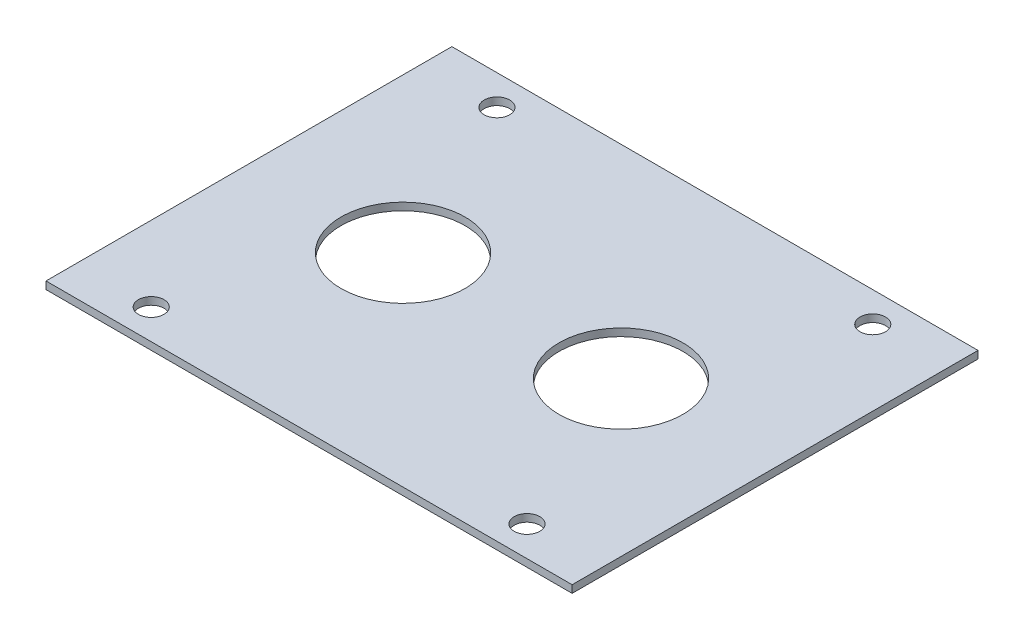
ISO-10303-21;
HEADER;
FILE_DESCRIPTION(('STEP AP214'),'2;1');
FILE_NAME('part.step','',(''),(''),'','','');
FILE_SCHEMA(('AUTOMOTIVE_DESIGN { 1 0 10303 214 1 1 1 1 }'));
ENDSEC;
DATA;
#1=APPLICATION_CONTEXT('core data for automotive mechanical design processes');
#2=APPLICATION_PROTOCOL_DEFINITION('international standard','automotive_design',2000,#1);
#3=PRODUCT_CONTEXT('',#1,'mechanical');
#4=PRODUCT('Part','Part','',(#3));
#5=PRODUCT_RELATED_PRODUCT_CATEGORY('part','',(#4));
#6=PRODUCT_DEFINITION_FORMATION('','',#4);
#7=PRODUCT_DEFINITION_CONTEXT('part definition',#1,'design');
#8=PRODUCT_DEFINITION('design','',#6,#7);
#9=PRODUCT_DEFINITION_SHAPE('','',#8);
#10=(LENGTH_UNIT() NAMED_UNIT(*) SI_UNIT(.MILLI.,.METRE.));
#11=(NAMED_UNIT(*) PLANE_ANGLE_UNIT() SI_UNIT($,.RADIAN.));
#12=(NAMED_UNIT(*) SI_UNIT($,.STERADIAN.) SOLID_ANGLE_UNIT());
#13=UNCERTAINTY_MEASURE_WITH_UNIT(LENGTH_MEASURE(1.E-05),#10,'distance_accuracy_value','');
#14=(GEOMETRIC_REPRESENTATION_CONTEXT(3) GLOBAL_UNCERTAINTY_ASSIGNED_CONTEXT((#13)) GLOBAL_UNIT_ASSIGNED_CONTEXT((#10,
#11,#12)) REPRESENTATION_CONTEXT('',''));
#15=CARTESIAN_POINT('',(0.,0.,0.));
#16=DIRECTION('',(0.,0.,1.));
#17=DIRECTION('',(1.,0.,0.));
#18=AXIS2_PLACEMENT_3D('',#15,#16,#17);
#19=CARTESIAN_POINT('',(35.,1.,-27.));
#20=DIRECTION('',(-1.,0.,0.));
#21=DIRECTION('',(0.,0.,1.));
#22=AXIS2_PLACEMENT_3D('',#19,#20,#21);
#23=PLANE('',#22);
#24=DIRECTION('',(0.,0.,-1.));
#25=VECTOR('',#24,1.);
#26=CARTESIAN_POINT('',(35.,0.,-27.));
#27=LINE('',#26,#25);
#28=CARTESIAN_POINT('',(35.,0.,27.));
#29=VERTEX_POINT('',#28);
#30=CARTESIAN_POINT('',(35.,0.,-27.));
#31=VERTEX_POINT('',#30);
#32=EDGE_CURVE('E106',#29,#31,#27,.T.);
#33=ORIENTED_EDGE('',*,*,#32,.T.);
#34=DIRECTION('',(0.,-1.,0.));
#35=VECTOR('',#34,1.);
#36=CARTESIAN_POINT('',(35.,1.,-27.));
#37=LINE('',#36,#35);
#38=CARTESIAN_POINT('',(35.,1.,-27.));
#39=VERTEX_POINT('',#38);
#40=EDGE_CURVE('E11',#39,#31,#37,.T.);
#41=ORIENTED_EDGE('',*,*,#40,.F.);
#42=DIRECTION('',(0.,0.,-1.));
#43=VECTOR('',#42,1.);
#44=CARTESIAN_POINT('',(35.,1.,-27.));
#45=LINE('',#44,#43);
#46=CARTESIAN_POINT('',(35.,1.,27.));
#47=VERTEX_POINT('',#46);
#48=EDGE_CURVE('E93',#47,#39,#45,.T.);
#49=ORIENTED_EDGE('',*,*,#48,.F.);
#50=DIRECTION('',(0.,-1.,0.));
#51=VECTOR('',#50,1.);
#52=CARTESIAN_POINT('',(35.,1.,27.));
#53=LINE('',#52,#51);
#54=EDGE_CURVE('E102',#47,#29,#53,.T.);
#55=ORIENTED_EDGE('',*,*,#54,.T.);
#56=EDGE_LOOP('',(#33,#41,#49,#55));
#57=FACE_BOUND('',#56,.T.);
#58=ADVANCED_FACE('F40',(#57),#23,.F.);
#59=CARTESIAN_POINT('',(-35.,1.,-27.));
#60=DIRECTION('',(0.,0.,1.));
#61=DIRECTION('',(1.,0.,0.));
#62=AXIS2_PLACEMENT_3D('',#59,#60,#61);
#63=PLANE('',#62);
#64=DIRECTION('',(-1.,0.,0.));
#65=VECTOR('',#64,1.);
#66=CARTESIAN_POINT('',(-35.,0.,-27.));
#67=LINE('',#66,#65);
#68=CARTESIAN_POINT('',(-35.,0.,-27.));
#69=VERTEX_POINT('',#68);
#70=EDGE_CURVE('E97',#31,#69,#67,.T.);
#71=ORIENTED_EDGE('',*,*,#70,.T.);
#72=DIRECTION('',(0.,-1.,0.));
#73=VECTOR('',#72,1.);
#74=CARTESIAN_POINT('',(-35.,1.,-27.));
#75=LINE('',#74,#73);
#76=CARTESIAN_POINT('',(-35.,1.,-27.));
#77=VERTEX_POINT('',#76);
#78=EDGE_CURVE('E49',#77,#69,#75,.T.);
#79=ORIENTED_EDGE('',*,*,#78,.F.);
#80=DIRECTION('',(-1.,0.,0.));
#81=VECTOR('',#80,1.);
#82=CARTESIAN_POINT('',(-35.,1.,-27.));
#83=LINE('',#82,#81);
#84=EDGE_CURVE('E88',#39,#77,#83,.T.);
#85=ORIENTED_EDGE('',*,*,#84,.F.);
#86=ORIENTED_EDGE('',*,*,#40,.T.);
#87=EDGE_LOOP('',(#71,#79,#85,#86));
#88=FACE_BOUND('',#87,.T.);
#89=ADVANCED_FACE('F96',(#88),#63,.F.);
#90=CARTESIAN_POINT('',(-35.,1.,-27.));
#91=DIRECTION('',(1.,0.,0.));
#92=DIRECTION('',(0.,0.,-1.));
#93=AXIS2_PLACEMENT_3D('',#90,#91,#92);
#94=PLANE('',#93);
#95=DIRECTION('',(0.,0.,1.));
#96=VECTOR('',#95,1.);
#97=CARTESIAN_POINT('',(-35.,0.,-27.));
#98=LINE('',#97,#96);
#99=CARTESIAN_POINT('',(-35.,0.,27.));
#100=VERTEX_POINT('',#99);
#101=EDGE_CURVE('E75',#69,#100,#98,.T.);
#102=ORIENTED_EDGE('',*,*,#101,.T.);
#103=DIRECTION('',(0.,-1.,0.));
#104=VECTOR('',#103,1.);
#105=CARTESIAN_POINT('',(-35.,1.,27.));
#106=LINE('',#105,#104);
#107=CARTESIAN_POINT('',(-35.,1.,27.));
#108=VERTEX_POINT('',#107);
#109=EDGE_CURVE('E98',#108,#100,#106,.T.);
#110=ORIENTED_EDGE('',*,*,#109,.F.);
#111=DIRECTION('',(0.,0.,1.));
#112=VECTOR('',#111,1.);
#113=CARTESIAN_POINT('',(-35.,1.,-27.));
#114=LINE('',#113,#112);
#115=EDGE_CURVE('E91',#77,#108,#114,.T.);
#116=ORIENTED_EDGE('',*,*,#115,.F.);
#117=ORIENTED_EDGE('',*,*,#78,.T.);
#118=EDGE_LOOP('',(#102,#110,#116,#117));
#119=FACE_BOUND('',#118,.T.);
#120=ADVANCED_FACE('F100',(#119),#94,.F.);
#121=CARTESIAN_POINT('',(-35.,1.,27.));
#122=DIRECTION('',(0.,0.,-1.));
#123=DIRECTION('',(-1.,0.,0.));
#124=AXIS2_PLACEMENT_3D('',#121,#122,#123);
#125=PLANE('',#124);
#126=DIRECTION('',(1.,0.,0.));
#127=VECTOR('',#126,1.);
#128=CARTESIAN_POINT('',(-35.,0.,27.));
#129=LINE('',#128,#127);
#130=EDGE_CURVE('E81',#100,#29,#129,.T.);
#131=ORIENTED_EDGE('',*,*,#130,.T.);
#132=ORIENTED_EDGE('',*,*,#54,.F.);
#133=DIRECTION('',(1.,0.,0.));
#134=VECTOR('',#133,1.);
#135=CARTESIAN_POINT('',(-35.,1.,27.));
#136=LINE('',#135,#134);
#137=EDGE_CURVE('E58',#108,#47,#136,.T.);
#138=ORIENTED_EDGE('',*,*,#137,.F.);
#139=ORIENTED_EDGE('',*,*,#109,.T.);
#140=EDGE_LOOP('',(#131,#132,#138,#139));
#141=FACE_BOUND('',#140,.T.);
#142=ADVANCED_FACE('F157',(#141),#125,.F.);
#143=CARTESIAN_POINT('',(0.,1.,0.));
#144=DIRECTION('',(0.,1.,0.));
#145=DIRECTION('',(0.,0.,1.));
#146=AXIS2_PLACEMENT_3D('',#143,#144,#145);
#147=PLANE('',#146);
#148=CARTESIAN_POINT('',(-25.,1.,23.));
#149=DIRECTION('',(0.,1.,0.));
#150=DIRECTION('',(0.,0.,1.));
#151=AXIS2_PLACEMENT_3D('',#148,#149,#150);
#152=CIRCLE('',#151,1.7);
#153=CARTESIAN_POINT('',(-25.,1.,24.7));
#154=VERTEX_POINT('',#153);
#155=EDGE_CURVE('E148',#154,#154,#152,.T.);
#156=ORIENTED_EDGE('',*,*,#155,.F.);
#157=EDGE_LOOP('',(#156));
#158=FACE_BOUND('',#157,.T.);
#159=CARTESIAN_POINT('',(25.,1.,23.));
#160=DIRECTION('',(0.,1.,0.));
#161=DIRECTION('',(0.,0.,1.));
#162=AXIS2_PLACEMENT_3D('',#159,#160,#161);
#163=CIRCLE('',#162,1.7);
#164=CARTESIAN_POINT('',(25.,1.,24.7));
#165=VERTEX_POINT('',#164);
#166=EDGE_CURVE('E142',#165,#165,#163,.T.);
#167=ORIENTED_EDGE('',*,*,#166,.F.);
#168=EDGE_LOOP('',(#167));
#169=FACE_BOUND('',#168,.T.);
#170=CARTESIAN_POINT('',(24.9999999999998,1.,-23.));
#171=DIRECTION('',(0.,1.,0.));
#172=DIRECTION('',(0.,0.,1.));
#173=AXIS2_PLACEMENT_3D('',#170,#171,#172);
#174=CIRCLE('',#173,1.7);
#175=CARTESIAN_POINT('',(24.9999999999998,1.,-21.3));
#176=VERTEX_POINT('',#175);
#177=EDGE_CURVE('E136',#176,#176,#174,.T.);
#178=ORIENTED_EDGE('',*,*,#177,.F.);
#179=EDGE_LOOP('',(#178));
#180=FACE_BOUND('',#179,.T.);
#181=CARTESIAN_POINT('',(-25.0000000000002,1.,-23.));
#182=DIRECTION('',(0.,1.,0.));
#183=DIRECTION('',(0.,0.,1.));
#184=AXIS2_PLACEMENT_3D('',#181,#182,#183);
#185=CIRCLE('',#184,1.7);
#186=CARTESIAN_POINT('',(-25.0000000000002,1.,-21.3));
#187=VERTEX_POINT('',#186);
#188=EDGE_CURVE('E130',#187,#187,#185,.T.);
#189=ORIENTED_EDGE('',*,*,#188,.F.);
#190=EDGE_LOOP('',(#189));
#191=FACE_BOUND('',#190,.T.);
#192=CARTESIAN_POINT('',(14.5,1.,0.));
#193=DIRECTION('',(0.,1.,0.));
#194=DIRECTION('',(0.,0.,1.));
#195=AXIS2_PLACEMENT_3D('',#192,#193,#194);
#196=CIRCLE('',#195,8.25);
#197=CARTESIAN_POINT('',(14.5,1.,8.25));
#198=VERTEX_POINT('',#197);
#199=EDGE_CURVE('E123',#198,#198,#196,.T.);
#200=ORIENTED_EDGE('',*,*,#199,.F.);
#201=EDGE_LOOP('',(#200));
#202=FACE_BOUND('',#201,.T.);
#203=CARTESIAN_POINT('',(-14.5,1.,0.));
#204=DIRECTION('',(0.,1.,0.));
#205=DIRECTION('',(0.,0.,1.));
#206=AXIS2_PLACEMENT_3D('',#203,#204,#205);
#207=CIRCLE('',#206,8.25);
#208=CARTESIAN_POINT('',(-14.5,1.,8.25));
#209=VERTEX_POINT('',#208);
#210=EDGE_CURVE('E115',#209,#209,#207,.T.);
#211=ORIENTED_EDGE('',*,*,#210,.F.);
#212=EDGE_LOOP('',(#211));
#213=FACE_BOUND('',#212,.T.);
#214=ORIENTED_EDGE('',*,*,#48,.T.);
#215=ORIENTED_EDGE('',*,*,#84,.T.);
#216=ORIENTED_EDGE('',*,*,#115,.T.);
#217=ORIENTED_EDGE('',*,*,#137,.T.);
#218=EDGE_LOOP('',(#214,#215,#216,#217));
#219=FACE_BOUND('',#218,.T.);
#220=ADVANCED_FACE('F89',(#158,#169,#180,#191,#202,#213,#219),#147,.T.);
#221=CARTESIAN_POINT('',(0.,0.,0.));
#222=DIRECTION('',(0.,1.,0.));
#223=DIRECTION('',(0.,0.,1.));
#224=AXIS2_PLACEMENT_3D('',#221,#222,#223);
#225=PLANE('',#224);
#226=CARTESIAN_POINT('',(-25.,0.,23.));
#227=DIRECTION('',(0.,1.,0.));
#228=DIRECTION('',(0.,0.,1.));
#229=AXIS2_PLACEMENT_3D('',#226,#227,#228);
#230=CIRCLE('',#229,1.7);
#231=CARTESIAN_POINT('',(-25.,0.,24.7));
#232=VERTEX_POINT('',#231);
#233=EDGE_CURVE('E145',#232,#232,#230,.T.);
#234=ORIENTED_EDGE('',*,*,#233,.T.);
#235=EDGE_LOOP('',(#234));
#236=FACE_BOUND('',#235,.T.);
#237=CARTESIAN_POINT('',(25.,0.,23.));
#238=DIRECTION('',(0.,1.,0.));
#239=DIRECTION('',(0.,0.,1.));
#240=AXIS2_PLACEMENT_3D('',#237,#238,#239);
#241=CIRCLE('',#240,1.7);
#242=CARTESIAN_POINT('',(25.,0.,24.7));
#243=VERTEX_POINT('',#242);
#244=EDGE_CURVE('E139',#243,#243,#241,.T.);
#245=ORIENTED_EDGE('',*,*,#244,.T.);
#246=EDGE_LOOP('',(#245));
#247=FACE_BOUND('',#246,.T.);
#248=CARTESIAN_POINT('',(24.9999999999998,0.,-23.));
#249=DIRECTION('',(0.,1.,0.));
#250=DIRECTION('',(0.,0.,1.));
#251=AXIS2_PLACEMENT_3D('',#248,#249,#250);
#252=CIRCLE('',#251,1.7);
#253=CARTESIAN_POINT('',(24.9999999999998,0.,-21.3));
#254=VERTEX_POINT('',#253);
#255=EDGE_CURVE('E133',#254,#254,#252,.T.);
#256=ORIENTED_EDGE('',*,*,#255,.T.);
#257=EDGE_LOOP('',(#256));
#258=FACE_BOUND('',#257,.T.);
#259=CARTESIAN_POINT('',(-25.0000000000002,0.,-23.));
#260=DIRECTION('',(0.,1.,0.));
#261=DIRECTION('',(0.,0.,1.));
#262=AXIS2_PLACEMENT_3D('',#259,#260,#261);
#263=CIRCLE('',#262,1.7);
#264=CARTESIAN_POINT('',(-25.0000000000002,0.,-21.3));
#265=VERTEX_POINT('',#264);
#266=EDGE_CURVE('E127',#265,#265,#263,.T.);
#267=ORIENTED_EDGE('',*,*,#266,.T.);
#268=EDGE_LOOP('',(#267));
#269=FACE_BOUND('',#268,.T.);
#270=CARTESIAN_POINT('',(14.5,0.,0.));
#271=DIRECTION('',(0.,1.,0.));
#272=DIRECTION('',(0.,0.,1.));
#273=AXIS2_PLACEMENT_3D('',#270,#271,#272);
#274=CIRCLE('',#273,8.25);
#275=CARTESIAN_POINT('',(14.5,0.,8.25));
#276=VERTEX_POINT('',#275);
#277=EDGE_CURVE('E43',#276,#276,#274,.T.);
#278=ORIENTED_EDGE('',*,*,#277,.T.);
#279=EDGE_LOOP('',(#278));
#280=FACE_BOUND('',#279,.T.);
#281=CARTESIAN_POINT('',(-14.5,0.,0.));
#282=DIRECTION('',(0.,1.,0.));
#283=DIRECTION('',(0.,0.,1.));
#284=AXIS2_PLACEMENT_3D('',#281,#282,#283);
#285=CIRCLE('',#284,8.25);
#286=CARTESIAN_POINT('',(-14.5,0.,8.25));
#287=VERTEX_POINT('',#286);
#288=EDGE_CURVE('E109',#287,#287,#285,.T.);
#289=ORIENTED_EDGE('',*,*,#288,.T.);
#290=EDGE_LOOP('',(#289));
#291=FACE_BOUND('',#290,.T.);
#292=ORIENTED_EDGE('',*,*,#32,.F.);
#293=ORIENTED_EDGE('',*,*,#130,.F.);
#294=ORIENTED_EDGE('',*,*,#101,.F.);
#295=ORIENTED_EDGE('',*,*,#70,.F.);
#296=EDGE_LOOP('',(#292,#293,#294,#295));
#297=FACE_BOUND('',#296,.T.);
#298=ADVANCED_FACE('F156',(#236,#247,#258,#269,#280,#291,#297),#225,.F.);
#299=CARTESIAN_POINT('',(-14.5,-9.,0.));
#300=DIRECTION('',(0.,1.,0.));
#301=DIRECTION('',(0.,0.,1.));
#302=AXIS2_PLACEMENT_3D('',#299,#300,#301);
#303=CYLINDRICAL_SURFACE('',#302,8.25);
#304=ORIENTED_EDGE('',*,*,#210,.T.);
#305=EDGE_LOOP('',(#304));
#306=FACE_BOUND('',#305,.T.);
#307=ORIENTED_EDGE('',*,*,#288,.F.);
#308=EDGE_LOOP('',(#307));
#309=FACE_BOUND('',#308,.T.);
#310=ADVANCED_FACE('F172',(#306,#309),#303,.F.);
#311=CARTESIAN_POINT('',(14.5,-9.,0.));
#312=DIRECTION('',(0.,1.,0.));
#313=DIRECTION('',(0.,0.,1.));
#314=AXIS2_PLACEMENT_3D('',#311,#312,#313);
#315=CYLINDRICAL_SURFACE('',#314,8.25);
#316=ORIENTED_EDGE('',*,*,#199,.T.);
#317=EDGE_LOOP('',(#316));
#318=FACE_BOUND('',#317,.T.);
#319=ORIENTED_EDGE('',*,*,#277,.F.);
#320=EDGE_LOOP('',(#319));
#321=FACE_BOUND('',#320,.T.);
#322=ADVANCED_FACE('F168',(#318,#321),#315,.F.);
#323=CARTESIAN_POINT('',(-25.0000000000002,1.,-23.));
#324=DIRECTION('',(0.,1.,0.));
#325=DIRECTION('',(0.,0.,1.));
#326=AXIS2_PLACEMENT_3D('',#323,#324,#325);
#327=CYLINDRICAL_SURFACE('',#326,1.7);
#328=ORIENTED_EDGE('',*,*,#266,.F.);
#329=EDGE_LOOP('',(#328));
#330=FACE_BOUND('',#329,.T.);
#331=ORIENTED_EDGE('',*,*,#188,.T.);
#332=EDGE_LOOP('',(#331));
#333=FACE_BOUND('',#332,.T.);
#334=ADVANCED_FACE('F171',(#330,#333),#327,.F.);
#335=CARTESIAN_POINT('',(24.9999999999998,1.,-23.));
#336=DIRECTION('',(0.,1.,0.));
#337=DIRECTION('',(0.,0.,1.));
#338=AXIS2_PLACEMENT_3D('',#335,#336,#337);
#339=CYLINDRICAL_SURFACE('',#338,1.7);
#340=ORIENTED_EDGE('',*,*,#255,.F.);
#341=EDGE_LOOP('',(#340));
#342=FACE_BOUND('',#341,.T.);
#343=ORIENTED_EDGE('',*,*,#177,.T.);
#344=EDGE_LOOP('',(#343));
#345=FACE_BOUND('',#344,.T.);
#346=ADVANCED_FACE('F241',(#342,#345),#339,.F.);
#347=CARTESIAN_POINT('',(25.,1.,23.));
#348=DIRECTION('',(0.,1.,0.));
#349=DIRECTION('',(0.,0.,1.));
#350=AXIS2_PLACEMENT_3D('',#347,#348,#349);
#351=CYLINDRICAL_SURFACE('',#350,1.7);
#352=ORIENTED_EDGE('',*,*,#244,.F.);
#353=EDGE_LOOP('',(#352));
#354=FACE_BOUND('',#353,.T.);
#355=ORIENTED_EDGE('',*,*,#166,.T.);
#356=EDGE_LOOP('',(#355));
#357=FACE_BOUND('',#356,.T.);
#358=ADVANCED_FACE('F251',(#354,#357),#351,.F.);
#359=CARTESIAN_POINT('',(-25.,1.,23.));
#360=DIRECTION('',(0.,1.,0.));
#361=DIRECTION('',(0.,0.,1.));
#362=AXIS2_PLACEMENT_3D('',#359,#360,#361);
#363=CYLINDRICAL_SURFACE('',#362,1.7);
#364=ORIENTED_EDGE('',*,*,#233,.F.);
#365=EDGE_LOOP('',(#364));
#366=FACE_BOUND('',#365,.T.);
#367=ORIENTED_EDGE('',*,*,#155,.T.);
#368=EDGE_LOOP('',(#367));
#369=FACE_BOUND('',#368,.T.);
#370=ADVANCED_FACE('F152',(#366,#369),#363,.F.);
#371=CLOSED_SHELL('',(#58,#89,#120,#142,#220,#298,#310,#322,#334,#346,#358,#370));
#372=MANIFOLD_SOLID_BREP('B2',#371);
#373=ADVANCED_BREP_SHAPE_REPRESENTATION('',(#18,#372),#14);
#374=SHAPE_DEFINITION_REPRESENTATION(#9,#373);
ENDSEC;
END-ISO-10303-21;
